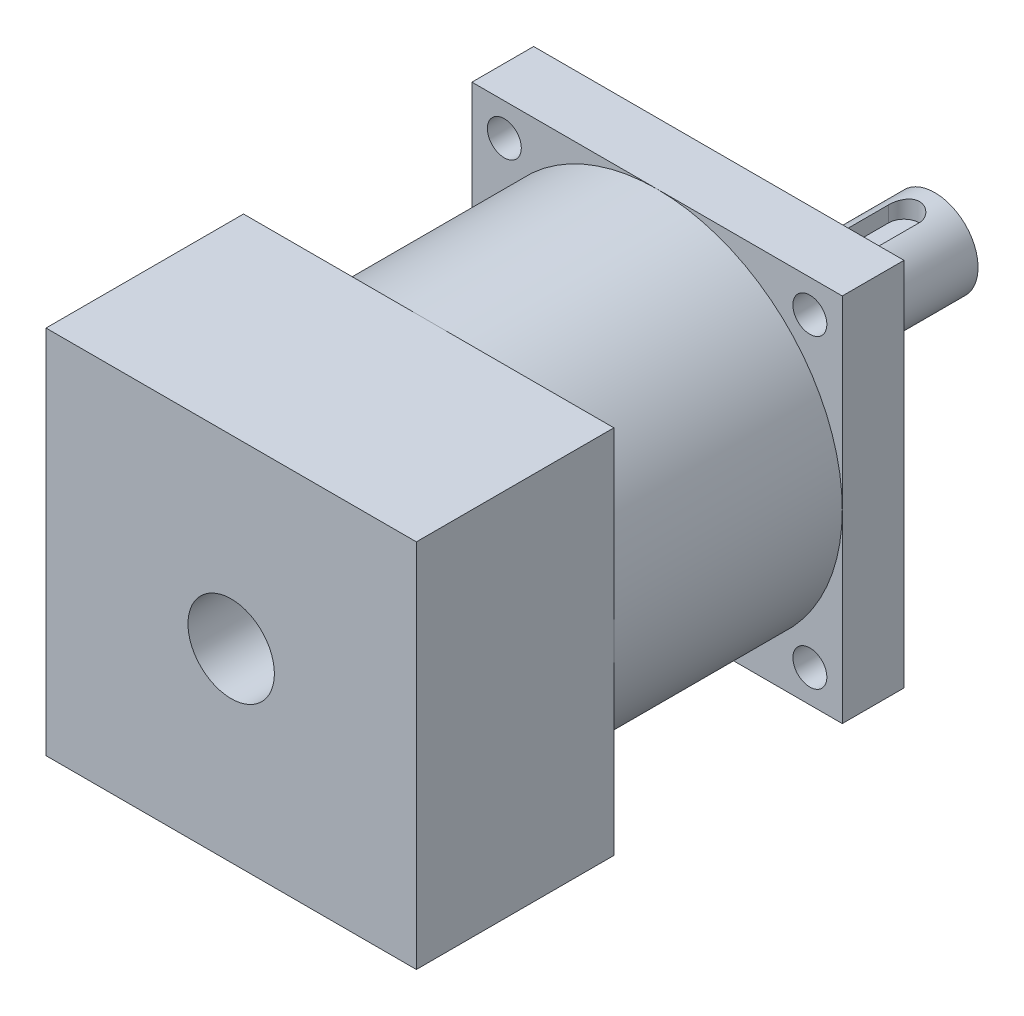
ISO-10303-21;
HEADER;
FILE_DESCRIPTION(('STEP AP214'),'2;1');
FILE_NAME('part.step','',(''),(''),'','','');
FILE_SCHEMA(('AUTOMOTIVE_DESIGN { 1 0 10303 214 1 1 1 1 }'));
ENDSEC;
DATA;
#1=APPLICATION_CONTEXT('core data for automotive mechanical design processes');
#2=APPLICATION_PROTOCOL_DEFINITION('international standard','automotive_design',2000,#1);
#3=PRODUCT_CONTEXT('',#1,'mechanical');
#4=PRODUCT('Part','Part','',(#3));
#5=PRODUCT_RELATED_PRODUCT_CATEGORY('part','',(#4));
#6=PRODUCT_DEFINITION_FORMATION('','',#4);
#7=PRODUCT_DEFINITION_CONTEXT('part definition',#1,'design');
#8=PRODUCT_DEFINITION('design','',#6,#7);
#9=PRODUCT_DEFINITION_SHAPE('','',#8);
#10=(LENGTH_UNIT() NAMED_UNIT(*) SI_UNIT(.MILLI.,.METRE.));
#11=(NAMED_UNIT(*) PLANE_ANGLE_UNIT() SI_UNIT($,.RADIAN.));
#12=(NAMED_UNIT(*) SI_UNIT($,.STERADIAN.) SOLID_ANGLE_UNIT());
#13=UNCERTAINTY_MEASURE_WITH_UNIT(LENGTH_MEASURE(1.E-05),#10,'distance_accuracy_value','');
#14=(GEOMETRIC_REPRESENTATION_CONTEXT(3) GLOBAL_UNCERTAINTY_ASSIGNED_CONTEXT((#13)) GLOBAL_UNIT_ASSIGNED_CONTEXT((#10,
#11,#12)) REPRESENTATION_CONTEXT('',''));
#15=CARTESIAN_POINT('',(0.,0.,0.));
#16=DIRECTION('',(0.,0.,1.));
#17=DIRECTION('',(1.,0.,0.));
#18=AXIS2_PLACEMENT_3D('',#15,#16,#17);
#19=CARTESIAN_POINT('',(30.,-30.,-5.));
#20=DIRECTION('',(0.,0.,-1.));
#21=DIRECTION('',(-1.,0.,0.));
#22=AXIS2_PLACEMENT_3D('',#19,#20,#21);
#23=PLANE('',#22);
#24=CARTESIAN_POINT('',(30.,-30.,-5.));
#25=DIRECTION('',(0.,0.,-1.));
#26=DIRECTION('',(-1.,0.,0.));
#27=AXIS2_PLACEMENT_3D('',#24,#25,#26);
#28=CIRCLE('',#27,8.5);
#29=CARTESIAN_POINT('',(21.5,-30.,-5.));
#30=VERTEX_POINT('',#29);
#31=EDGE_CURVE('E209',#30,#30,#28,.T.);
#32=ORIENTED_EDGE('',*,*,#31,.T.);
#33=EDGE_LOOP('',(#32));
#34=FACE_BOUND('',#33,.T.);
#35=CARTESIAN_POINT('',(30.,-30.,-5.));
#36=DIRECTION('',(0.,0.,-1.));
#37=DIRECTION('',(-1.,0.,0.));
#38=AXIS2_PLACEMENT_3D('',#35,#36,#37);
#39=CIRCLE('',#38,7.);
#40=CARTESIAN_POINT('',(23.,-30.,-5.));
#41=VERTEX_POINT('',#40);
#42=EDGE_CURVE('E199',#41,#41,#39,.T.);
#43=ORIENTED_EDGE('',*,*,#42,.F.);
#44=EDGE_LOOP('',(#43));
#45=FACE_BOUND('',#44,.T.);
#46=ADVANCED_FACE('F36',(#34,#45),#23,.T.);
#47=CARTESIAN_POINT('',(30.,-30.,-3.));
#48=DIRECTION('',(0.,0.,-1.));
#49=DIRECTION('',(-1.,0.,0.));
#50=AXIS2_PLACEMENT_3D('',#47,#48,#49);
#51=PLANE('',#50);
#52=CARTESIAN_POINT('',(30.,-30.,-3.));
#53=DIRECTION('',(0.,0.,-1.));
#54=DIRECTION('',(-1.,0.,0.));
#55=AXIS2_PLACEMENT_3D('',#52,#53,#54);
#56=CIRCLE('',#55,25.);
#57=CARTESIAN_POINT('',(5.,-30.,-3.));
#58=VERTEX_POINT('',#57);
#59=EDGE_CURVE('E212',#58,#58,#56,.T.);
#60=ORIENTED_EDGE('',*,*,#59,.T.);
#61=EDGE_LOOP('',(#60));
#62=FACE_BOUND('',#61,.T.);
#63=CARTESIAN_POINT('',(30.,-30.,-3.));
#64=DIRECTION('',(0.,0.,-1.));
#65=DIRECTION('',(-1.,0.,0.));
#66=AXIS2_PLACEMENT_3D('',#63,#64,#65);
#67=CIRCLE('',#66,8.5);
#68=CARTESIAN_POINT('',(21.5,-30.,-3.));
#69=VERTEX_POINT('',#68);
#70=EDGE_CURVE('E206',#69,#69,#67,.T.);
#71=ORIENTED_EDGE('',*,*,#70,.F.);
#72=EDGE_LOOP('',(#71));
#73=FACE_BOUND('',#72,.T.);
#74=ADVANCED_FACE('F370',(#62,#73),#51,.T.);
#75=CARTESIAN_POINT('',(0.,-60.,0.));
#76=DIRECTION('',(0.,0.,1.));
#77=DIRECTION('',(1.,0.,0.));
#78=AXIS2_PLACEMENT_3D('',#75,#76,#77);
#79=PLANE('',#78);
#80=CARTESIAN_POINT('',(54.7487373415298,-5.25126265847118,0.));
#81=DIRECTION('',(0.,0.,-1.));
#82=DIRECTION('',(-1.,0.,0.));
#83=AXIS2_PLACEMENT_3D('',#80,#81,#82);
#84=CIRCLE('',#83,2.74999999999923);
#85=CARTESIAN_POINT('',(51.9987373415305,-5.25126265847118,0.));
#86=VERTEX_POINT('',#85);
#87=EDGE_CURVE('E176',#86,#86,#84,.T.);
#88=ORIENTED_EDGE('',*,*,#87,.F.);
#89=EDGE_LOOP('',(#88));
#90=FACE_BOUND('',#89,.T.);
#91=CARTESIAN_POINT('',(54.7487373415287,-54.7487373415296,0.));
#92=DIRECTION('',(0.,0.,-1.));
#93=DIRECTION('',(-1.,0.,0.));
#94=AXIS2_PLACEMENT_3D('',#91,#92,#93);
#95=CIRCLE('',#94,2.74999999999965);
#96=CARTESIAN_POINT('',(51.9987373415291,-54.7487373415296,0.));
#97=VERTEX_POINT('',#96);
#98=EDGE_CURVE('E184',#97,#97,#95,.T.);
#99=ORIENTED_EDGE('',*,*,#98,.F.);
#100=EDGE_LOOP('',(#99));
#101=FACE_BOUND('',#100,.T.);
#102=CARTESIAN_POINT('',(5.25126265846978,-54.7487373415292,0.));
#103=DIRECTION('',(0.,0.,-1.));
#104=DIRECTION('',(-1.,0.,0.));
#105=AXIS2_PLACEMENT_3D('',#102,#103,#104);
#106=CIRCLE('',#105,2.75);
#107=CARTESIAN_POINT('',(2.50126265846978,-54.7487373415292,0.));
#108=VERTEX_POINT('',#107);
#109=EDGE_CURVE('E188',#108,#108,#106,.T.);
#110=ORIENTED_EDGE('',*,*,#109,.F.);
#111=EDGE_LOOP('',(#110));
#112=FACE_BOUND('',#111,.T.);
#113=CARTESIAN_POINT('',(5.25126265847084,-5.25126265847084,0.));
#114=DIRECTION('',(0.,0.,-1.));
#115=DIRECTION('',(-1.,0.,0.));
#116=AXIS2_PLACEMENT_3D('',#113,#114,#115);
#117=CIRCLE('',#116,2.75);
#118=CARTESIAN_POINT('',(2.50126265847084,-5.25126265847084,0.));
#119=VERTEX_POINT('',#118);
#120=EDGE_CURVE('E192',#119,#119,#117,.T.);
#121=ORIENTED_EDGE('',*,*,#120,.F.);
#122=EDGE_LOOP('',(#121));
#123=FACE_BOUND('',#122,.T.);
#124=DIRECTION('',(0.,-1.,0.));
#125=VECTOR('',#124,1.);
#126=CARTESIAN_POINT('',(0.,0.,0.));
#127=LINE('',#126,#125);
#128=CARTESIAN_POINT('',(0.,0.,0.));
#129=VERTEX_POINT('',#128);
#130=CARTESIAN_POINT('',(0.,-60.,0.));
#131=VERTEX_POINT('',#130);
#132=EDGE_CURVE('E258',#129,#131,#127,.T.);
#133=ORIENTED_EDGE('',*,*,#132,.F.);
#134=DIRECTION('',(-1.,0.,0.));
#135=VECTOR('',#134,1.);
#136=CARTESIAN_POINT('',(0.,0.,0.));
#137=LINE('',#136,#135);
#138=CARTESIAN_POINT('',(60.,0.,0.));
#139=VERTEX_POINT('',#138);
#140=EDGE_CURVE('E286',#139,#129,#137,.T.);
#141=ORIENTED_EDGE('',*,*,#140,.F.);
#142=DIRECTION('',(0.,1.,0.));
#143=VECTOR('',#142,1.);
#144=CARTESIAN_POINT('',(60.,0.,0.));
#145=LINE('',#144,#143);
#146=CARTESIAN_POINT('',(60.,-60.,0.));
#147=VERTEX_POINT('',#146);
#148=EDGE_CURVE('E284',#147,#139,#145,.T.);
#149=ORIENTED_EDGE('',*,*,#148,.F.);
#150=DIRECTION('',(1.,0.,0.));
#151=VECTOR('',#150,1.);
#152=CARTESIAN_POINT('',(0.,-60.,0.));
#153=LINE('',#152,#151);
#154=EDGE_CURVE('E282',#131,#147,#153,.T.);
#155=ORIENTED_EDGE('',*,*,#154,.F.);
#156=EDGE_LOOP('',(#133,#141,#149,#155));
#157=FACE_BOUND('',#156,.T.);
#158=CARTESIAN_POINT('',(30.,-30.,0.));
#159=DIRECTION('',(0.,0.,1.));
#160=DIRECTION('',(1.,0.,0.));
#161=AXIS2_PLACEMENT_3D('',#158,#159,#160);
#162=CIRCLE('',#161,25.);
#163=CARTESIAN_POINT('',(55.,-30.,0.));
#164=VERTEX_POINT('',#163);
#165=EDGE_CURVE('E299',#164,#164,#162,.F.);
#166=ORIENTED_EDGE('',*,*,#165,.F.);
#167=EDGE_LOOP('',(#166));
#168=FACE_BOUND('',#167,.T.);
#169=ADVANCED_FACE('F375',(#90,#101,#112,#123,#157,#168),#79,.F.);
#170=CARTESIAN_POINT('',(0.,-60.,10.));
#171=DIRECTION('',(0.,0.,1.));
#172=DIRECTION('',(1.,0.,0.));
#173=AXIS2_PLACEMENT_3D('',#170,#171,#172);
#174=PLANE('',#173);
#175=CARTESIAN_POINT('',(54.7487373415298,-5.25126265847118,10.));
#176=DIRECTION('',(0.,0.,1.));
#177=DIRECTION('',(1.,0.,0.));
#178=AXIS2_PLACEMENT_3D('',#175,#176,#177);
#179=CIRCLE('',#178,2.74999999999923);
#180=CARTESIAN_POINT('',(57.498737341529,-5.25126265847118,10.));
#181=VERTEX_POINT('',#180);
#182=EDGE_CURVE('E183',#181,#181,#179,.T.);
#183=ORIENTED_EDGE('',*,*,#182,.F.);
#184=EDGE_LOOP('',(#183));
#185=FACE_BOUND('',#184,.T.);
#186=CARTESIAN_POINT('',(30.,-30.,10.));
#187=DIRECTION('',(0.,0.,1.));
#188=DIRECTION('',(1.,0.,0.));
#189=AXIS2_PLACEMENT_3D('',#186,#187,#188);
#190=CIRCLE('',#189,30.);
#191=CARTESIAN_POINT('',(60.,-30.,10.));
#192=VERTEX_POINT('',#191);
#193=CARTESIAN_POINT('',(30.,0.,10.));
#194=VERTEX_POINT('',#193);
#195=EDGE_CURVE('E254',#192,#194,#190,.T.);
#196=ORIENTED_EDGE('',*,*,#195,.F.);
#197=DIRECTION('',(0.,1.,0.));
#198=VECTOR('',#197,1.);
#199=CARTESIAN_POINT('',(60.,0.,10.));
#200=LINE('',#199,#198);
#201=CARTESIAN_POINT('',(60.,0.,10.));
#202=VERTEX_POINT('',#201);
#203=EDGE_CURVE('E272',#192,#202,#200,.T.);
#204=ORIENTED_EDGE('',*,*,#203,.T.);
#205=DIRECTION('',(-1.,0.,0.));
#206=VECTOR('',#205,1.);
#207=CARTESIAN_POINT('',(0.,0.,10.));
#208=LINE('',#207,#206);
#209=EDGE_CURVE('E276',#202,#194,#208,.T.);
#210=ORIENTED_EDGE('',*,*,#209,.T.);
#211=EDGE_LOOP('',(#196,#204,#210));
#212=FACE_BOUND('',#211,.T.);
#213=ADVANCED_FACE('F421',(#185,#212),#174,.T.);
#214=CARTESIAN_POINT('',(5.25126265847084,-5.25126265847084,10.));
#215=DIRECTION('',(0.,0.,1.));
#216=DIRECTION('',(1.,0.,0.));
#217=AXIS2_PLACEMENT_3D('',#214,#215,#216);
#218=CIRCLE('',#217,2.75);
#219=CARTESIAN_POINT('',(8.00126265847084,-5.25126265847084,10.));
#220=VERTEX_POINT('',#219);
#221=EDGE_CURVE('E195',#220,#220,#218,.T.);
#222=ORIENTED_EDGE('',*,*,#221,.F.);
#223=EDGE_LOOP('',(#222));
#224=FACE_BOUND('',#223,.T.);
#225=CARTESIAN_POINT('',(0.,-30.,10.));
#226=VERTEX_POINT('',#225);
#227=EDGE_CURVE('E262',#194,#226,#190,.T.);
#228=ORIENTED_EDGE('',*,*,#227,.F.);
#229=CARTESIAN_POINT('',(0.,0.,10.));
#230=VERTEX_POINT('',#229);
#231=EDGE_CURVE('E275',#194,#230,#208,.T.);
#232=ORIENTED_EDGE('',*,*,#231,.T.);
#233=DIRECTION('',(0.,-1.,0.));
#234=VECTOR('',#233,1.);
#235=CARTESIAN_POINT('',(0.,0.,10.));
#236=LINE('',#235,#234);
#237=EDGE_CURVE('E264',#230,#226,#236,.T.);
#238=ORIENTED_EDGE('',*,*,#237,.T.);
#239=EDGE_LOOP('',(#228,#232,#238));
#240=FACE_BOUND('',#239,.T.);
#241=ADVANCED_FACE('F458',(#224,#240),#174,.T.);
#242=CARTESIAN_POINT('',(5.25126265846978,-54.7487373415292,10.));
#243=DIRECTION('',(0.,0.,1.));
#244=DIRECTION('',(1.,0.,0.));
#245=AXIS2_PLACEMENT_3D('',#242,#243,#244);
#246=CIRCLE('',#245,2.75);
#247=CARTESIAN_POINT('',(8.00126265846978,-54.7487373415292,10.));
#248=VERTEX_POINT('',#247);
#249=EDGE_CURVE('E191',#248,#248,#246,.T.);
#250=ORIENTED_EDGE('',*,*,#249,.F.);
#251=EDGE_LOOP('',(#250));
#252=FACE_BOUND('',#251,.T.);
#253=CARTESIAN_POINT('',(30.,-60.,10.));
#254=VERTEX_POINT('',#253);
#255=EDGE_CURVE('E462',#226,#254,#190,.T.);
#256=ORIENTED_EDGE('',*,*,#255,.F.);
#257=CARTESIAN_POINT('',(0.,-60.,10.));
#258=VERTEX_POINT('',#257);
#259=EDGE_CURVE('E268',#226,#258,#236,.T.);
#260=ORIENTED_EDGE('',*,*,#259,.T.);
#261=DIRECTION('',(1.,0.,0.));
#262=VECTOR('',#261,1.);
#263=CARTESIAN_POINT('',(0.,-60.,10.));
#264=LINE('',#263,#262);
#265=EDGE_CURVE('E269',#258,#254,#264,.T.);
#266=ORIENTED_EDGE('',*,*,#265,.T.);
#267=EDGE_LOOP('',(#256,#260,#266));
#268=FACE_BOUND('',#267,.T.);
#269=ADVANCED_FACE('F422',(#252,#268),#174,.T.);
#270=CARTESIAN_POINT('',(0.,0.,10.));
#271=DIRECTION('',(1.,0.,0.));
#272=DIRECTION('',(0.,1.,0.));
#273=AXIS2_PLACEMENT_3D('',#270,#271,#272);
#274=PLANE('',#273);
#275=ORIENTED_EDGE('',*,*,#132,.T.);
#276=DIRECTION('',(0.,0.,-1.));
#277=VECTOR('',#276,1.);
#278=CARTESIAN_POINT('',(0.,-60.,10.));
#279=LINE('',#278,#277);
#280=EDGE_CURVE('E296',#258,#131,#279,.T.);
#281=ORIENTED_EDGE('',*,*,#280,.F.);
#282=ORIENTED_EDGE('',*,*,#259,.F.);
#283=ORIENTED_EDGE('',*,*,#237,.F.);
#284=DIRECTION('',(0.,0.,-1.));
#285=VECTOR('',#284,1.);
#286=CARTESIAN_POINT('',(0.,0.,10.));
#287=LINE('',#286,#285);
#288=EDGE_CURVE('E279',#230,#129,#287,.T.);
#289=ORIENTED_EDGE('',*,*,#288,.T.);
#290=EDGE_LOOP('',(#275,#281,#282,#283,#289));
#291=FACE_BOUND('',#290,.T.);
#292=ADVANCED_FACE('F38',(#291),#274,.F.);
#293=CARTESIAN_POINT('',(0.,-60.,10.));
#294=DIRECTION('',(0.,1.,0.));
#295=DIRECTION('',(0.,0.,1.));
#296=AXIS2_PLACEMENT_3D('',#293,#294,#295);
#297=PLANE('',#296);
#298=ORIENTED_EDGE('',*,*,#154,.T.);
#299=DIRECTION('',(0.,0.,-1.));
#300=VECTOR('',#299,1.);
#301=CARTESIAN_POINT('',(60.,-60.,10.));
#302=LINE('',#301,#300);
#303=CARTESIAN_POINT('',(60.,-60.,10.));
#304=VERTEX_POINT('',#303);
#305=EDGE_CURVE('E293',#304,#147,#302,.T.);
#306=ORIENTED_EDGE('',*,*,#305,.F.);
#307=EDGE_CURVE('E267',#254,#304,#264,.T.);
#308=ORIENTED_EDGE('',*,*,#307,.F.);
#309=ORIENTED_EDGE('',*,*,#265,.F.);
#310=ORIENTED_EDGE('',*,*,#280,.T.);
#311=EDGE_LOOP('',(#298,#306,#308,#309,#310));
#312=FACE_BOUND('',#311,.T.);
#313=ADVANCED_FACE('F431',(#312),#297,.F.);
#314=CARTESIAN_POINT('',(60.,0.,10.));
#315=DIRECTION('',(-1.,0.,0.));
#316=DIRECTION('',(0.,-1.,0.));
#317=AXIS2_PLACEMENT_3D('',#314,#315,#316);
#318=PLANE('',#317);
#319=ORIENTED_EDGE('',*,*,#148,.T.);
#320=DIRECTION('',(0.,0.,-1.));
#321=VECTOR('',#320,1.);
#322=CARTESIAN_POINT('',(60.,0.,10.));
#323=LINE('',#322,#321);
#324=EDGE_CURVE('E290',#202,#139,#323,.T.);
#325=ORIENTED_EDGE('',*,*,#324,.F.);
#326=ORIENTED_EDGE('',*,*,#203,.F.);
#327=EDGE_CURVE('E273',#304,#192,#200,.T.);
#328=ORIENTED_EDGE('',*,*,#327,.F.);
#329=ORIENTED_EDGE('',*,*,#305,.T.);
#330=EDGE_LOOP('',(#319,#325,#326,#328,#329));
#331=FACE_BOUND('',#330,.T.);
#332=ADVANCED_FACE('F428',(#331),#318,.F.);
#333=CARTESIAN_POINT('',(0.,0.,10.));
#334=DIRECTION('',(0.,-1.,0.));
#335=DIRECTION('',(0.,0.,-1.));
#336=AXIS2_PLACEMENT_3D('',#333,#334,#335);
#337=PLANE('',#336);
#338=ORIENTED_EDGE('',*,*,#140,.T.);
#339=ORIENTED_EDGE('',*,*,#288,.F.);
#340=ORIENTED_EDGE('',*,*,#231,.F.);
#341=ORIENTED_EDGE('',*,*,#209,.F.);
#342=ORIENTED_EDGE('',*,*,#324,.T.);
#343=EDGE_LOOP('',(#338,#339,#340,#341,#342));
#344=FACE_BOUND('',#343,.T.);
#345=ADVANCED_FACE('F419',(#344),#337,.F.);
#346=CARTESIAN_POINT('',(54.7487373415287,-54.7487373415296,10.));
#347=DIRECTION('',(0.,0.,1.));
#348=DIRECTION('',(1.,0.,0.));
#349=AXIS2_PLACEMENT_3D('',#346,#347,#348);
#350=CIRCLE('',#349,2.74999999999965);
#351=CARTESIAN_POINT('',(57.4987373415284,-54.7487373415296,10.));
#352=VERTEX_POINT('',#351);
#353=EDGE_CURVE('E187',#352,#352,#350,.T.);
#354=ORIENTED_EDGE('',*,*,#353,.F.);
#355=EDGE_LOOP('',(#354));
#356=FACE_BOUND('',#355,.T.);
#357=EDGE_CURVE('E263',#254,#192,#190,.T.);
#358=ORIENTED_EDGE('',*,*,#357,.F.);
#359=ORIENTED_EDGE('',*,*,#307,.T.);
#360=ORIENTED_EDGE('',*,*,#327,.T.);
#361=EDGE_LOOP('',(#358,#359,#360));
#362=FACE_BOUND('',#361,.T.);
#363=ADVANCED_FACE('F416',(#356,#362),#174,.T.);
#364=CARTESIAN_POINT('',(30.,-30.,47.));
#365=DIRECTION('',(0.,0.,-1.));
#366=DIRECTION('',(-1.,0.,0.));
#367=AXIS2_PLACEMENT_3D('',#364,#365,#366);
#368=CYLINDRICAL_SURFACE('',#367,30.);
#369=CARTESIAN_POINT('',(30.,-30.,47.));
#370=DIRECTION('',(0.,0.,1.));
#371=DIRECTION('',(1.,0.,0.));
#372=AXIS2_PLACEMENT_3D('',#369,#370,#371);
#373=CIRCLE('',#372,30.);
#374=CARTESIAN_POINT('',(60.,-30.,47.));
#375=VERTEX_POINT('',#374);
#376=CARTESIAN_POINT('',(30.,0.,47.));
#377=VERTEX_POINT('',#376);
#378=EDGE_CURVE('E255',#375,#377,#373,.T.);
#379=ORIENTED_EDGE('',*,*,#378,.F.);
#380=CARTESIAN_POINT('',(30.,-60.,47.));
#381=VERTEX_POINT('',#380);
#382=EDGE_CURVE('E59',#381,#375,#373,.T.);
#383=ORIENTED_EDGE('',*,*,#382,.F.);
#384=CARTESIAN_POINT('',(0.,-30.,47.));
#385=VERTEX_POINT('',#384);
#386=EDGE_CURVE('E700',#385,#381,#373,.T.);
#387=ORIENTED_EDGE('',*,*,#386,.F.);
#388=EDGE_CURVE('E259',#377,#385,#373,.T.);
#389=ORIENTED_EDGE('',*,*,#388,.F.);
#390=EDGE_LOOP('',(#379,#383,#387,#389));
#391=FACE_BOUND('',#390,.T.);
#392=ORIENTED_EDGE('',*,*,#195,.T.);
#393=ORIENTED_EDGE('',*,*,#227,.T.);
#394=ORIENTED_EDGE('',*,*,#255,.T.);
#395=ORIENTED_EDGE('',*,*,#357,.T.);
#396=EDGE_LOOP('',(#392,#393,#394,#395));
#397=FACE_BOUND('',#396,.T.);
#398=ADVANCED_FACE('F396',(#391,#397),#368,.T.);
#399=CARTESIAN_POINT('',(0.,-60.,47.));
#400=DIRECTION('',(0.,0.,1.));
#401=DIRECTION('',(1.,0.,0.));
#402=AXIS2_PLACEMENT_3D('',#399,#400,#401);
#403=PLANE('',#402);
#404=DIRECTION('',(0.,1.,0.));
#405=VECTOR('',#404,1.);
#406=CARTESIAN_POINT('',(60.,0.,47.));
#407=LINE('',#406,#405);
#408=CARTESIAN_POINT('',(60.,0.,47.));
#409=VERTEX_POINT('',#408);
#410=EDGE_CURVE('E236',#375,#409,#407,.T.);
#411=ORIENTED_EDGE('',*,*,#410,.F.);
#412=ORIENTED_EDGE('',*,*,#378,.T.);
#413=DIRECTION('',(-1.,0.,0.));
#414=VECTOR('',#413,1.);
#415=CARTESIAN_POINT('',(0.,0.,47.));
#416=LINE('',#415,#414);
#417=EDGE_CURVE('E222',#409,#377,#416,.T.);
#418=ORIENTED_EDGE('',*,*,#417,.F.);
#419=EDGE_LOOP('',(#411,#412,#418));
#420=FACE_BOUND('',#419,.T.);
#421=ADVANCED_FACE('F392',(#420),#403,.F.);
#422=CARTESIAN_POINT('',(0.,0.,47.));
#423=VERTEX_POINT('',#422);
#424=EDGE_CURVE('E240',#377,#423,#416,.T.);
#425=ORIENTED_EDGE('',*,*,#424,.F.);
#426=ORIENTED_EDGE('',*,*,#388,.T.);
#427=DIRECTION('',(0.,-1.,0.));
#428=VECTOR('',#427,1.);
#429=CARTESIAN_POINT('',(0.,0.,47.));
#430=LINE('',#429,#428);
#431=EDGE_CURVE('E229',#423,#385,#430,.T.);
#432=ORIENTED_EDGE('',*,*,#431,.F.);
#433=EDGE_LOOP('',(#425,#426,#432));
#434=FACE_BOUND('',#433,.T.);
#435=ADVANCED_FACE('F395',(#434),#403,.F.);
#436=CARTESIAN_POINT('',(0.,-60.,47.));
#437=VERTEX_POINT('',#436);
#438=EDGE_CURVE('E217',#385,#437,#430,.T.);
#439=ORIENTED_EDGE('',*,*,#438,.F.);
#440=ORIENTED_EDGE('',*,*,#386,.T.);
#441=DIRECTION('',(1.,0.,0.));
#442=VECTOR('',#441,1.);
#443=CARTESIAN_POINT('',(0.,-60.,47.));
#444=LINE('',#443,#442);
#445=EDGE_CURVE('E233',#437,#381,#444,.T.);
#446=ORIENTED_EDGE('',*,*,#445,.F.);
#447=EDGE_LOOP('',(#439,#440,#446));
#448=FACE_BOUND('',#447,.T.);
#449=ADVANCED_FACE('F650',(#448),#403,.F.);
#450=CARTESIAN_POINT('',(60.,-60.,47.));
#451=VERTEX_POINT('',#450);
#452=EDGE_CURVE('E232',#381,#451,#444,.T.);
#453=ORIENTED_EDGE('',*,*,#452,.F.);
#454=ORIENTED_EDGE('',*,*,#382,.T.);
#455=EDGE_CURVE('E237',#451,#375,#407,.T.);
#456=ORIENTED_EDGE('',*,*,#455,.F.);
#457=EDGE_LOOP('',(#453,#454,#456));
#458=FACE_BOUND('',#457,.T.);
#459=ADVANCED_FACE('F398',(#458),#403,.F.);
#460=CARTESIAN_POINT('',(0.,0.,79.));
#461=DIRECTION('',(1.,0.,0.));
#462=DIRECTION('',(0.,0.,-1.));
#463=AXIS2_PLACEMENT_3D('',#460,#461,#462);
#464=PLANE('',#463);
#465=ORIENTED_EDGE('',*,*,#431,.T.);
#466=ORIENTED_EDGE('',*,*,#438,.T.);
#467=DIRECTION('',(0.,0.,-1.));
#468=VECTOR('',#467,1.);
#469=CARTESIAN_POINT('',(0.,-60.,79.));
#470=LINE('',#469,#468);
#471=CARTESIAN_POINT('',(0.,-60.,79.));
#472=VERTEX_POINT('',#471);
#473=EDGE_CURVE('E251',#472,#437,#470,.T.);
#474=ORIENTED_EDGE('',*,*,#473,.F.);
#475=DIRECTION('',(0.,-1.,0.));
#476=VECTOR('',#475,1.);
#477=CARTESIAN_POINT('',(0.,0.,79.));
#478=LINE('',#477,#476);
#479=CARTESIAN_POINT('',(0.,0.,79.));
#480=VERTEX_POINT('',#479);
#481=EDGE_CURVE('E218',#480,#472,#478,.T.);
#482=ORIENTED_EDGE('',*,*,#481,.F.);
#483=DIRECTION('',(0.,0.,-1.));
#484=VECTOR('',#483,1.);
#485=CARTESIAN_POINT('',(0.,0.,79.));
#486=LINE('',#485,#484);
#487=EDGE_CURVE('E228',#480,#423,#486,.T.);
#488=ORIENTED_EDGE('',*,*,#487,.T.);
#489=EDGE_LOOP('',(#465,#466,#474,#482,#488));
#490=FACE_BOUND('',#489,.T.);
#491=ADVANCED_FACE('F409',(#490),#464,.F.);
#492=CARTESIAN_POINT('',(0.,-60.,79.));
#493=DIRECTION('',(0.,1.,0.));
#494=DIRECTION('',(0.,0.,1.));
#495=AXIS2_PLACEMENT_3D('',#492,#493,#494);
#496=PLANE('',#495);
#497=ORIENTED_EDGE('',*,*,#445,.T.);
#498=ORIENTED_EDGE('',*,*,#452,.T.);
#499=DIRECTION('',(0.,0.,-1.));
#500=VECTOR('',#499,1.);
#501=CARTESIAN_POINT('',(60.,-60.,79.));
#502=LINE('',#501,#500);
#503=CARTESIAN_POINT('',(60.,-60.,79.));
#504=VERTEX_POINT('',#503);
#505=EDGE_CURVE('E248',#504,#451,#502,.T.);
#506=ORIENTED_EDGE('',*,*,#505,.F.);
#507=DIRECTION('',(1.,0.,0.));
#508=VECTOR('',#507,1.);
#509=CARTESIAN_POINT('',(0.,-60.,79.));
#510=LINE('',#509,#508);
#511=EDGE_CURVE('E221',#472,#504,#510,.T.);
#512=ORIENTED_EDGE('',*,*,#511,.F.);
#513=ORIENTED_EDGE('',*,*,#473,.T.);
#514=EDGE_LOOP('',(#497,#498,#506,#512,#513));
#515=FACE_BOUND('',#514,.T.);
#516=ADVANCED_FACE('F405',(#515),#496,.F.);
#517=CARTESIAN_POINT('',(60.,0.,79.));
#518=DIRECTION('',(-1.,0.,0.));
#519=DIRECTION('',(0.,0.,1.));
#520=AXIS2_PLACEMENT_3D('',#517,#518,#519);
#521=PLANE('',#520);
#522=ORIENTED_EDGE('',*,*,#455,.T.);
#523=ORIENTED_EDGE('',*,*,#410,.T.);
#524=DIRECTION('',(0.,0.,-1.));
#525=VECTOR('',#524,1.);
#526=CARTESIAN_POINT('',(60.,0.,79.));
#527=LINE('',#526,#525);
#528=CARTESIAN_POINT('',(60.,0.,79.));
#529=VERTEX_POINT('',#528);
#530=EDGE_CURVE('E245',#529,#409,#527,.T.);
#531=ORIENTED_EDGE('',*,*,#530,.F.);
#532=DIRECTION('',(0.,1.,0.));
#533=VECTOR('',#532,1.);
#534=CARTESIAN_POINT('',(60.,0.,79.));
#535=LINE('',#534,#533);
#536=EDGE_CURVE('E224',#504,#529,#535,.T.);
#537=ORIENTED_EDGE('',*,*,#536,.F.);
#538=ORIENTED_EDGE('',*,*,#505,.T.);
#539=EDGE_LOOP('',(#522,#523,#531,#537,#538));
#540=FACE_BOUND('',#539,.T.);
#541=ADVANCED_FACE('F401',(#540),#521,.F.);
#542=CARTESIAN_POINT('',(0.,0.,79.));
#543=DIRECTION('',(0.,-1.,0.));
#544=DIRECTION('',(0.,0.,-1.));
#545=AXIS2_PLACEMENT_3D('',#542,#543,#544);
#546=PLANE('',#545);
#547=ORIENTED_EDGE('',*,*,#417,.T.);
#548=ORIENTED_EDGE('',*,*,#424,.T.);
#549=ORIENTED_EDGE('',*,*,#487,.F.);
#550=DIRECTION('',(-1.,0.,0.));
#551=VECTOR('',#550,1.);
#552=CARTESIAN_POINT('',(0.,0.,79.));
#553=LINE('',#552,#551);
#554=EDGE_CURVE('E226',#529,#480,#553,.T.);
#555=ORIENTED_EDGE('',*,*,#554,.F.);
#556=ORIENTED_EDGE('',*,*,#530,.T.);
#557=EDGE_LOOP('',(#547,#548,#549,#555,#556));
#558=FACE_BOUND('',#557,.T.);
#559=ADVANCED_FACE('F390',(#558),#546,.F.);
#560=CARTESIAN_POINT('',(0.,-60.,79.));
#561=DIRECTION('',(0.,0.,1.));
#562=DIRECTION('',(1.,0.,0.));
#563=AXIS2_PLACEMENT_3D('',#560,#561,#562);
#564=PLANE('',#563);
#565=CARTESIAN_POINT('',(30.,-30.,79.));
#566=DIRECTION('',(0.,0.,1.));
#567=DIRECTION('',(1.,0.,0.));
#568=AXIS2_PLACEMENT_3D('',#565,#566,#567);
#569=CIRCLE('',#568,7.);
#570=CARTESIAN_POINT('',(37.,-30.,79.));
#571=VERTEX_POINT('',#570);
#572=EDGE_CURVE('E200',#571,#571,#569,.T.);
#573=ORIENTED_EDGE('',*,*,#572,.F.);
#574=EDGE_LOOP('',(#573));
#575=FACE_BOUND('',#574,.T.);
#576=ORIENTED_EDGE('',*,*,#481,.T.);
#577=ORIENTED_EDGE('',*,*,#511,.T.);
#578=ORIENTED_EDGE('',*,*,#536,.T.);
#579=ORIENTED_EDGE('',*,*,#554,.T.);
#580=EDGE_LOOP('',(#576,#577,#578,#579));
#581=FACE_BOUND('',#580,.T.);
#582=ADVANCED_FACE('F386',(#575,#581),#564,.T.);
#583=CARTESIAN_POINT('',(30.,-30.,-3.));
#584=DIRECTION('',(0.,0.,1.));
#585=DIRECTION('',(1.,0.,0.));
#586=AXIS2_PLACEMENT_3D('',#583,#584,#585);
#587=CYLINDRICAL_SURFACE('',#586,25.);
#588=ORIENTED_EDGE('',*,*,#59,.F.);
#589=EDGE_LOOP('',(#588));
#590=FACE_BOUND('',#589,.T.);
#591=ORIENTED_EDGE('',*,*,#165,.T.);
#592=EDGE_LOOP('',(#591));
#593=FACE_BOUND('',#592,.T.);
#594=ADVANCED_FACE('F381',(#590,#593),#587,.T.);
#595=CARTESIAN_POINT('',(30.,-30.,-5.));
#596=DIRECTION('',(0.,0.,1.));
#597=DIRECTION('',(1.,0.,0.));
#598=AXIS2_PLACEMENT_3D('',#595,#596,#597);
#599=CYLINDRICAL_SURFACE('',#598,8.5);
#600=ORIENTED_EDGE('',*,*,#31,.F.);
#601=EDGE_LOOP('',(#600));
#602=FACE_BOUND('',#601,.T.);
#603=ORIENTED_EDGE('',*,*,#70,.T.);
#604=EDGE_LOOP('',(#603));
#605=FACE_BOUND('',#604,.T.);
#606=ADVANCED_FACE('F367',(#602,#605),#599,.T.);
#607=CARTESIAN_POINT('',(30.,-30.,-35.));
#608=DIRECTION('',(0.,0.,1.));
#609=DIRECTION('',(1.,0.,0.));
#610=AXIS2_PLACEMENT_3D('',#607,#608,#609);
#611=CYLINDRICAL_SURFACE('',#610,7.);
#612=DIRECTION('',(0.,0.,1.));
#613=VECTOR('',#612,1.);
#614=CARTESIAN_POINT('',(32.5,-23.461651584689,-35.));
#615=LINE('',#614,#613);
#616=CARTESIAN_POINT('',(32.5,-23.461651584689,-30.));
#617=VERTEX_POINT('',#616);
#618=CARTESIAN_POINT('',(32.5,-23.461651584689,-9.99999999999999));
#619=VERTEX_POINT('',#618);
#620=EDGE_CURVE('E11',#617,#619,#615,.T.);
#621=ORIENTED_EDGE('',*,*,#620,.T.);
#622=CARTESIAN_POINT('',(32.5,-23.461651584689,-9.99999999999999));
#623=CARTESIAN_POINT('',(32.500009322209,-23.4616634621487,-9.93211075427106));
#624=CARTESIAN_POINT('',(32.4972348507669,-23.4605945007726,-9.86422806736091));
#625=CARTESIAN_POINT('',(32.4861910211816,-23.4563834252187,-9.72899608938858));
#626=CARTESIAN_POINT('',(32.4779233455121,-23.4532419458194,-9.66164664139387));
#627=CARTESIAN_POINT('',(32.456001752859,-23.4449878236206,-9.52817858539721));
#628=CARTESIAN_POINT('',(32.4423655996395,-23.4398816829432,-9.46205666366018));
#629=CARTESIAN_POINT('',(32.4098511546665,-23.4278682214582,-9.33129816489152));
#630=CARTESIAN_POINT('',(32.3909726310744,-23.4209608209925,-9.26666165368757));
#631=CARTESIAN_POINT('',(32.326739641792,-23.3978506563429,-9.07573563352248));
#632=CARTESIAN_POINT('',(32.2737511260699,-23.3792452465916,-8.95220954786442));
#633=CARTESIAN_POINT('',(32.1491075786542,-23.3377460263929,-8.71576966687202));
#634=CARTESIAN_POINT('',(32.0774389504885,-23.3148490957512,-8.60286368326447));
#635=CARTESIAN_POINT('',(31.9140257110197,-23.2662008620778,-8.38578478664728));
#636=CARTESIAN_POINT('',(31.8215833714674,-23.2403713595863,-8.28215352480412));
#637=CARTESIAN_POINT('',(31.6207338877633,-23.1894240767697,-8.09149129528357));
#638=CARTESIAN_POINT('',(31.5123237755267,-23.1643064298013,-8.00446342075664));
#639=CARTESIAN_POINT('',(31.2785391533593,-23.1166886672095,-7.84691014454501));
#640=CARTESIAN_POINT('',(31.1527483378919,-23.094291647762,-7.77696847813946));
#641=CARTESIAN_POINT('',(30.8902508254766,-23.0555764232737,-7.65946335320259));
#642=CARTESIAN_POINT('',(30.7535478905403,-23.0392561341453,-7.61189222095398));
#643=CARTESIAN_POINT('',(30.4788299792562,-23.0150894948929,-7.54235939781763));
#644=CARTESIAN_POINT('',(30.3410798352275,-23.0069340564749,-7.51946086952891));
#645=CARTESIAN_POINT('',(30.0634643052969,-22.9989120194618,-7.49693159722235));
#646=CARTESIAN_POINT('',(29.9235995154926,-22.999043126973,-7.49729441396535));
#647=CARTESIAN_POINT('',(29.6524067415131,-23.0073774195092,-7.52071127376111));
#648=CARTESIAN_POINT('',(29.5209775929213,-23.0152175641648,-7.54274479419852));
#649=CARTESIAN_POINT('',(29.2638241878564,-23.0376216749265,-7.6071734241588));
#650=CARTESIAN_POINT('',(29.1381002542195,-23.0521860210096,-7.64956968436252));
#651=CARTESIAN_POINT('',(28.8938389757019,-23.0868349310963,-7.75404691156532));
#652=CARTESIAN_POINT('',(28.7754272093309,-23.1069940783569,-7.81639571496012));
#653=CARTESIAN_POINT('',(28.5504646869448,-23.1507664438368,-7.95877933522336));
#654=CARTESIAN_POINT('',(28.4439175482323,-23.1743807104074,-8.03881952378359));
#655=CARTESIAN_POINT('',(28.2396755474393,-23.2240945219451,-8.2193232636567));
#656=CARTESIAN_POINT('',(28.1427581429958,-23.2502594415613,-8.3206497231449));
#657=CARTESIAN_POINT('',(27.967000853787,-23.3010965753102,-8.53832736416557));
#658=CARTESIAN_POINT('',(27.8881674454354,-23.3257682523474,-8.65468390516847));
#659=CARTESIAN_POINT('',(27.7495013910154,-23.3712219612459,-8.90194259852197));
#660=CARTESIAN_POINT('',(27.6900579201037,-23.3919212488101,-9.03307897550541));
#661=CARTESIAN_POINT('',(27.5944456027415,-23.4261178638973,-9.30436480158218));
#662=CARTESIAN_POINT('',(27.5582388060005,-23.4396269283495,-9.44449914116898));
#663=CARTESIAN_POINT('',(27.5229450285137,-23.4529145775444,-9.65503054426421));
#664=CARTESIAN_POINT('',(27.5143465241356,-23.4561798903209,-9.72373630177179));
#665=CARTESIAN_POINT('',(27.5028764782512,-23.4605508917032,-9.86161516419168));
#666=CARTESIAN_POINT('',(27.4999986033463,-23.4616589685906,-9.93078766710051));
#667=CARTESIAN_POINT('',(27.5,-23.461651584689,-9.99999999999999));
#668=B_SPLINE_CURVE_WITH_KNOTS('',3,(#622,#623,#624,#625,#626,#627,#628,#629,#630,#631,#632,
#633,#634,#635,#636,#637,#638,#639,#640,#641,#642,#643,#644,#645,#646,#647,#648,#649,#650,#651,
#652,#653,#654,#655,#656,#657,#658,#659,#660,#661,#662,#663,#664,#665,#666,#667),.UNSPECIFIED.,
.F.,.F.,(4,2,2,2,2,2,2,2,2,2,2,2,2,2,2,2,2,2,2,2,2,2,4),(0.,0.203591628551589,0.407120929225528,
0.609982356545742,0.812852756635989,1.21793118555512,1.6233052814847,2.0451597231193,
2.4670926781184,2.9018839896556,3.33652604665237,3.75400993940861,4.17137826416922,
4.56998920861347,4.96862268086887,5.37284909448639,5.77719841367921,6.20315837945088,
6.6292706567472,7.06347329058504,7.49696496492444,7.70468580162772,7.91217653896403),.UNSPECIFIED.);
#669=CARTESIAN_POINT('',(27.5,-23.461651584689,-9.99999999999999));
#670=VERTEX_POINT('',#669);
#671=EDGE_CURVE('E302',#619,#670,#668,.T.);
#672=ORIENTED_EDGE('',*,*,#671,.T.);
#673=DIRECTION('',(0.,0.,1.));
#674=VECTOR('',#673,1.);
#675=CARTESIAN_POINT('',(27.5,-23.461651584689,-35.));
#676=LINE('',#675,#674);
#677=CARTESIAN_POINT('',(27.5,-23.461651584689,-30.));
#678=VERTEX_POINT('',#677);
#679=EDGE_CURVE('E44',#670,#678,#676,.F.);
#680=ORIENTED_EDGE('',*,*,#679,.T.);
#681=CARTESIAN_POINT('',(27.5,-23.461651584689,-30.));
#682=CARTESIAN_POINT('',(27.499990677791,-23.4616634621487,-30.0678892457289));
#683=CARTESIAN_POINT('',(27.5027651492331,-23.4605945007726,-30.1357719326391));
#684=CARTESIAN_POINT('',(27.5138089788184,-23.4563834252187,-30.2710039106114));
#685=CARTESIAN_POINT('',(27.5220766544879,-23.4532419458194,-30.3383533586061));
#686=CARTESIAN_POINT('',(27.543998247141,-23.4449878236206,-30.4718214146028));
#687=CARTESIAN_POINT('',(27.5576344003605,-23.4398816829432,-30.5379433363398));
#688=CARTESIAN_POINT('',(27.5901488453335,-23.4278682214582,-30.6687018351085));
#689=CARTESIAN_POINT('',(27.6090273689256,-23.4209608209925,-30.7333383463124));
#690=CARTESIAN_POINT('',(27.673260358208,-23.3978506563429,-30.9242643664775));
#691=CARTESIAN_POINT('',(27.7262488739301,-23.3792452465916,-31.0477904521356));
#692=CARTESIAN_POINT('',(27.8508924213458,-23.3377460263929,-31.284230333128));
#693=CARTESIAN_POINT('',(27.9225610495115,-23.3148490957512,-31.3971363167355));
#694=CARTESIAN_POINT('',(28.0859742889803,-23.2662008620778,-31.6142152133527));
#695=CARTESIAN_POINT('',(28.1784166285326,-23.2403713595863,-31.7178464751959));
#696=CARTESIAN_POINT('',(28.3792661122367,-23.1894240767697,-31.9085087047164));
#697=CARTESIAN_POINT('',(28.4876762244733,-23.1643064298013,-31.9955365792434));
#698=CARTESIAN_POINT('',(28.7214608466407,-23.1166886672095,-32.153089855455));
#699=CARTESIAN_POINT('',(28.8472516621082,-23.094291647762,-32.2230315218605));
#700=CARTESIAN_POINT('',(29.1097491745234,-23.0555764232737,-32.3405366467974));
#701=CARTESIAN_POINT('',(29.2464521094597,-23.0392561341453,-32.388107779046));
#702=CARTESIAN_POINT('',(29.5211700207438,-23.0150894948929,-32.4576406021824));
#703=CARTESIAN_POINT('',(29.6589201647725,-23.0069340564749,-32.4805391304711));
#704=CARTESIAN_POINT('',(29.9365356947031,-22.9989120194618,-32.5030684027776));
#705=CARTESIAN_POINT('',(30.0764004845075,-22.999043126973,-32.5027055860346));
#706=CARTESIAN_POINT('',(30.3475932584869,-23.0073774195092,-32.4792887262389));
#707=CARTESIAN_POINT('',(30.4790224070787,-23.0152175641648,-32.4572552058015));
#708=CARTESIAN_POINT('',(30.7361758121436,-23.0376216749265,-32.3928265758412));
#709=CARTESIAN_POINT('',(30.8618997457805,-23.0521860210096,-32.3504303156375));
#710=CARTESIAN_POINT('',(31.1061610242981,-23.0868349310963,-32.2459530884347));
#711=CARTESIAN_POINT('',(31.2245727906691,-23.1069940783569,-32.1836042850399));
#712=CARTESIAN_POINT('',(31.4495353130552,-23.1507664438368,-32.0412206647766));
#713=CARTESIAN_POINT('',(31.5560824517677,-23.1743807104074,-31.9611804762164));
#714=CARTESIAN_POINT('',(31.7603244525607,-23.2240945219451,-31.7806767363433));
#715=CARTESIAN_POINT('',(31.8572418570042,-23.2502594415613,-31.6793502768551));
#716=CARTESIAN_POINT('',(32.032999146213,-23.3010965753103,-31.4616726358344));
#717=CARTESIAN_POINT('',(32.1118325545646,-23.3257682523474,-31.3453160948315));
#718=CARTESIAN_POINT('',(32.2504986089846,-23.3712219612459,-31.098057401478));
#719=CARTESIAN_POINT('',(32.3099420798963,-23.3919212488101,-30.9669210244946));
#720=CARTESIAN_POINT('',(32.4055543972585,-23.4261178638973,-30.6956351984178));
#721=CARTESIAN_POINT('',(32.4417611939995,-23.4396269283495,-30.555500858831));
#722=CARTESIAN_POINT('',(32.4770549714863,-23.4529145775444,-30.3449694557358));
#723=CARTESIAN_POINT('',(32.4856534758644,-23.4561798903209,-30.2762636982282));
#724=CARTESIAN_POINT('',(32.4971235217488,-23.4605508917032,-30.1383848358083));
#725=CARTESIAN_POINT('',(32.5000013966537,-23.4616589685906,-30.0692123328995));
#726=CARTESIAN_POINT('',(32.5,-23.461651584689,-30.));
#727=B_SPLINE_CURVE_WITH_KNOTS('',3,(#681,#682,#683,#684,#685,#686,#687,#688,#689,#690,#691,
#692,#693,#694,#695,#696,#697,#698,#699,#700,#701,#702,#703,#704,#705,#706,#707,#708,#709,#710,
#711,#712,#713,#714,#715,#716,#717,#718,#719,#720,#721,#722,#723,#724,#725,#726),.UNSPECIFIED.,
.F.,.F.,(4,2,2,2,2,2,2,2,2,2,2,2,2,2,2,2,2,2,2,2,2,2,4),(0.,0.203591628551585,0.407120929225524,
0.609982356545741,0.812852756635989,1.21793118555512,1.6233052814847,2.0451597231193,
2.46709267811841,2.9018839896556,3.33652604665237,3.75400993940861,4.17137826416922,
4.56998920861347,4.96862268086887,5.37284909448639,5.7771984136792,6.20315837945087,
6.62927065674719,7.06347329058504,7.49696496492443,7.70468580162771,7.91217653896402),.UNSPECIFIED.);
#728=EDGE_CURVE('E51',#678,#617,#727,.T.);
#729=ORIENTED_EDGE('',*,*,#728,.T.);
#730=EDGE_LOOP('',(#621,#672,#680,#729));
#731=FACE_BOUND('',#730,.T.);
#732=CARTESIAN_POINT('',(30.,-30.,-35.));
#733=DIRECTION('',(0.,0.,-1.));
#734=DIRECTION('',(-1.,0.,0.));
#735=AXIS2_PLACEMENT_3D('',#732,#733,#734);
#736=CIRCLE('',#735,7.);
#737=CARTESIAN_POINT('',(23.,-30.,-35.));
#738=VERTEX_POINT('',#737);
#739=EDGE_CURVE('E203',#738,#738,#736,.T.);
#740=ORIENTED_EDGE('',*,*,#739,.F.);
#741=EDGE_LOOP('',(#740));
#742=FACE_BOUND('',#741,.T.);
#743=ORIENTED_EDGE('',*,*,#42,.T.);
#744=EDGE_LOOP('',(#743));
#745=FACE_BOUND('',#744,.T.);
#746=ADVANCED_FACE('F322',(#731,#742,#745),#611,.T.);
#747=CARTESIAN_POINT('',(30.,-30.,-35.));
#748=DIRECTION('',(0.,0.,-1.));
#749=DIRECTION('',(-1.,0.,0.));
#750=AXIS2_PLACEMENT_3D('',#747,#748,#749);
#751=PLANE('',#750);
#752=ORIENTED_EDGE('',*,*,#739,.T.);
#753=EDGE_LOOP('',(#752));
#754=FACE_BOUND('',#753,.T.);
#755=ADVANCED_FACE('F360',(#754),#751,.T.);
#756=CARTESIAN_POINT('',(30.,-30.,49.));
#757=DIRECTION('',(0.,0.,1.));
#758=DIRECTION('',(1.,0.,0.));
#759=AXIS2_PLACEMENT_3D('',#756,#757,#758);
#760=CYLINDRICAL_SURFACE('',#759,7.);
#761=CARTESIAN_POINT('',(30.,-30.,49.));
#762=DIRECTION('',(0.,0.,1.));
#763=DIRECTION('',(1.,0.,0.));
#764=AXIS2_PLACEMENT_3D('',#761,#762,#763);
#765=CIRCLE('',#764,7.);
#766=CARTESIAN_POINT('',(37.,-30.,49.));
#767=VERTEX_POINT('',#766);
#768=EDGE_CURVE('E196',#767,#767,#765,.T.);
#769=ORIENTED_EDGE('',*,*,#768,.F.);
#770=EDGE_LOOP('',(#769));
#771=FACE_BOUND('',#770,.T.);
#772=ORIENTED_EDGE('',*,*,#572,.T.);
#773=EDGE_LOOP('',(#772));
#774=FACE_BOUND('',#773,.T.);
#775=ADVANCED_FACE('F357',(#771,#774),#760,.F.);
#776=CARTESIAN_POINT('',(30.,-30.,49.));
#777=DIRECTION('',(0.,0.,1.));
#778=DIRECTION('',(1.,0.,0.));
#779=AXIS2_PLACEMENT_3D('',#776,#777,#778);
#780=PLANE('',#779);
#781=ORIENTED_EDGE('',*,*,#768,.T.);
#782=EDGE_LOOP('',(#781));
#783=FACE_BOUND('',#782,.T.);
#784=ADVANCED_FACE('F353',(#783),#780,.T.);
#785=CARTESIAN_POINT('',(5.25126265847084,-5.25126265847084,30.));
#786=DIRECTION('',(0.,0.,-1.));
#787=DIRECTION('',(-1.,0.,0.));
#788=AXIS2_PLACEMENT_3D('',#785,#786,#787);
#789=CYLINDRICAL_SURFACE('',#788,2.75);
#790=ORIENTED_EDGE('',*,*,#221,.T.);
#791=EDGE_LOOP('',(#790));
#792=FACE_BOUND('',#791,.T.);
#793=ORIENTED_EDGE('',*,*,#120,.T.);
#794=EDGE_LOOP('',(#793));
#795=FACE_BOUND('',#794,.T.);
#796=ADVANCED_FACE('F349',(#792,#795),#789,.F.);
#797=CARTESIAN_POINT('',(5.25126265846978,-54.7487373415292,30.));
#798=DIRECTION('',(0.,0.,-1.));
#799=DIRECTION('',(-1.,0.,0.));
#800=AXIS2_PLACEMENT_3D('',#797,#798,#799);
#801=CYLINDRICAL_SURFACE('',#800,2.75);
#802=ORIENTED_EDGE('',*,*,#249,.T.);
#803=EDGE_LOOP('',(#802));
#804=FACE_BOUND('',#803,.T.);
#805=ORIENTED_EDGE('',*,*,#109,.T.);
#806=EDGE_LOOP('',(#805));
#807=FACE_BOUND('',#806,.T.);
#808=ADVANCED_FACE('F345',(#804,#807),#801,.F.);
#809=CARTESIAN_POINT('',(54.7487373415287,-54.7487373415296,30.));
#810=DIRECTION('',(0.,0.,-1.));
#811=DIRECTION('',(-1.,0.,0.));
#812=AXIS2_PLACEMENT_3D('',#809,#810,#811);
#813=CYLINDRICAL_SURFACE('',#812,2.74999999999965);
#814=ORIENTED_EDGE('',*,*,#353,.T.);
#815=EDGE_LOOP('',(#814));
#816=FACE_BOUND('',#815,.T.);
#817=ORIENTED_EDGE('',*,*,#98,.T.);
#818=EDGE_LOOP('',(#817));
#819=FACE_BOUND('',#818,.T.);
#820=ADVANCED_FACE('F341',(#816,#819),#813,.F.);
#821=CARTESIAN_POINT('',(54.7487373415298,-5.25126265847118,30.));
#822=DIRECTION('',(0.,0.,-1.));
#823=DIRECTION('',(-1.,0.,0.));
#824=AXIS2_PLACEMENT_3D('',#821,#822,#823);
#825=CYLINDRICAL_SURFACE('',#824,2.74999999999923);
#826=ORIENTED_EDGE('',*,*,#182,.T.);
#827=EDGE_LOOP('',(#826));
#828=FACE_BOUND('',#827,.T.);
#829=ORIENTED_EDGE('',*,*,#87,.T.);
#830=EDGE_LOOP('',(#829));
#831=FACE_BOUND('',#830,.T.);
#832=ADVANCED_FACE('F338',(#828,#831),#825,.F.);
#833=CARTESIAN_POINT('',(30.,-26.,-30.));
#834=DIRECTION('',(0.,1.,0.));
#835=DIRECTION('',(0.,0.,1.));
#836=AXIS2_PLACEMENT_3D('',#833,#834,#835);
#837=CYLINDRICAL_SURFACE('',#836,2.5);
#838=DIRECTION('',(0.,1.,0.));
#839=VECTOR('',#838,1.);
#840=CARTESIAN_POINT('',(27.5,-26.,-30.));
#841=LINE('',#840,#839);
#842=CARTESIAN_POINT('',(27.5,-26.,-30.));
#843=VERTEX_POINT('',#842);
#844=EDGE_CURVE('E148',#843,#678,#841,.T.);
#845=ORIENTED_EDGE('',*,*,#844,.F.);
#846=CARTESIAN_POINT('',(30.,-26.,-30.));
#847=DIRECTION('',(0.,1.,0.));
#848=DIRECTION('',(0.,0.,1.));
#849=AXIS2_PLACEMENT_3D('',#846,#847,#848);
#850=CIRCLE('',#849,2.5);
#851=CARTESIAN_POINT('',(32.5,-26.,-30.));
#852=VERTEX_POINT('',#851);
#853=EDGE_CURVE('E152',#852,#843,#850,.T.);
#854=ORIENTED_EDGE('',*,*,#853,.F.);
#855=DIRECTION('',(0.,1.,0.));
#856=VECTOR('',#855,1.);
#857=CARTESIAN_POINT('',(32.5,-26.,-30.));
#858=LINE('',#857,#856);
#859=EDGE_CURVE('E174',#852,#617,#858,.T.);
#860=ORIENTED_EDGE('',*,*,#859,.T.);
#861=ORIENTED_EDGE('',*,*,#728,.F.);
#862=EDGE_LOOP('',(#845,#854,#860,#861));
#863=FACE_BOUND('',#862,.T.);
#864=ADVANCED_FACE('F150',(#863),#837,.F.);
#865=CARTESIAN_POINT('',(32.5,-26.,-9.99999999999999));
#866=DIRECTION('',(1.,0.,0.));
#867=DIRECTION('',(0.,0.,-1.));
#868=AXIS2_PLACEMENT_3D('',#865,#866,#867);
#869=PLANE('',#868);
#870=ORIENTED_EDGE('',*,*,#859,.F.);
#871=DIRECTION('',(0.,0.,-1.));
#872=VECTOR('',#871,1.);
#873=CARTESIAN_POINT('',(32.5,-26.,-9.99999999999999));
#874=LINE('',#873,#872);
#875=CARTESIAN_POINT('',(32.5,-26.,-9.99999999999999));
#876=VERTEX_POINT('',#875);
#877=EDGE_CURVE('E157',#876,#852,#874,.T.);
#878=ORIENTED_EDGE('',*,*,#877,.F.);
#879=DIRECTION('',(0.,1.,0.));
#880=VECTOR('',#879,1.);
#881=CARTESIAN_POINT('',(32.5,-26.,-9.99999999999999));
#882=LINE('',#881,#880);
#883=EDGE_CURVE('E177',#876,#619,#882,.T.);
#884=ORIENTED_EDGE('',*,*,#883,.T.);
#885=ORIENTED_EDGE('',*,*,#620,.F.);
#886=EDGE_LOOP('',(#870,#878,#884,#885));
#887=FACE_BOUND('',#886,.T.);
#888=ADVANCED_FACE('F331',(#887),#869,.F.);
#889=CARTESIAN_POINT('',(30.,-26.,-9.99999999999999));
#890=DIRECTION('',(0.,1.,0.));
#891=DIRECTION('',(0.,0.,1.));
#892=AXIS2_PLACEMENT_3D('',#889,#890,#891);
#893=CYLINDRICAL_SURFACE('',#892,2.5);
#894=ORIENTED_EDGE('',*,*,#883,.F.);
#895=CARTESIAN_POINT('',(30.,-26.,-9.99999999999999));
#896=DIRECTION('',(0.,1.,0.));
#897=DIRECTION('',(0.,0.,1.));
#898=AXIS2_PLACEMENT_3D('',#895,#896,#897);
#899=CIRCLE('',#898,2.5);
#900=CARTESIAN_POINT('',(27.5,-26.,-9.99999999999999));
#901=VERTEX_POINT('',#900);
#902=EDGE_CURVE('E166',#901,#876,#899,.T.);
#903=ORIENTED_EDGE('',*,*,#902,.F.);
#904=DIRECTION('',(0.,1.,0.));
#905=VECTOR('',#904,1.);
#906=CARTESIAN_POINT('',(27.5,-26.,-9.99999999999999));
#907=LINE('',#906,#905);
#908=EDGE_CURVE('E156',#901,#670,#907,.T.);
#909=ORIENTED_EDGE('',*,*,#908,.T.);
#910=ORIENTED_EDGE('',*,*,#671,.F.);
#911=EDGE_LOOP('',(#894,#903,#909,#910));
#912=FACE_BOUND('',#911,.T.);
#913=ADVANCED_FACE('F326',(#912),#893,.F.);
#914=CARTESIAN_POINT('',(27.5,-26.,-9.99999999999999));
#915=DIRECTION('',(-1.,0.,0.));
#916=DIRECTION('',(0.,0.,1.));
#917=AXIS2_PLACEMENT_3D('',#914,#915,#916);
#918=PLANE('',#917);
#919=ORIENTED_EDGE('',*,*,#908,.F.);
#920=DIRECTION('',(0.,0.,1.));
#921=VECTOR('',#920,1.);
#922=CARTESIAN_POINT('',(27.5,-26.,-9.99999999999999));
#923=LINE('',#922,#921);
#924=EDGE_CURVE('E160',#843,#901,#923,.T.);
#925=ORIENTED_EDGE('',*,*,#924,.F.);
#926=ORIENTED_EDGE('',*,*,#844,.T.);
#927=ORIENTED_EDGE('',*,*,#679,.F.);
#928=EDGE_LOOP('',(#919,#925,#926,#927));
#929=FACE_BOUND('',#928,.T.);
#930=ADVANCED_FACE('F161',(#929),#918,.F.);
#931=CARTESIAN_POINT('',(30.,-26.,-30.));
#932=DIRECTION('',(0.,1.,0.));
#933=DIRECTION('',(0.,0.,1.));
#934=AXIS2_PLACEMENT_3D('',#931,#932,#933);
#935=PLANE('',#934);
#936=ORIENTED_EDGE('',*,*,#853,.T.);
#937=ORIENTED_EDGE('',*,*,#924,.T.);
#938=ORIENTED_EDGE('',*,*,#902,.T.);
#939=ORIENTED_EDGE('',*,*,#877,.T.);
#940=EDGE_LOOP('',(#936,#937,#938,#939));
#941=FACE_BOUND('',#940,.T.);
#942=ADVANCED_FACE('F168',(#941),#935,.T.);
#943=CLOSED_SHELL('',(#46,#74,#169,#213,#241,#269,#292,#313,#332,#345,#363,#398,#421,#435,#449,
#459,#491,#516,#541,#559,#582,#594,#606,#746,#755,#775,#784,#796,#808,#820,#832,#864,#888,#913,
#930,#942));
#944=MANIFOLD_SOLID_BREP('B2',#943);
#945=ADVANCED_BREP_SHAPE_REPRESENTATION('',(#18,#944),#14);
#946=SHAPE_DEFINITION_REPRESENTATION(#9,#945);
ENDSEC;
END-ISO-10303-21;
